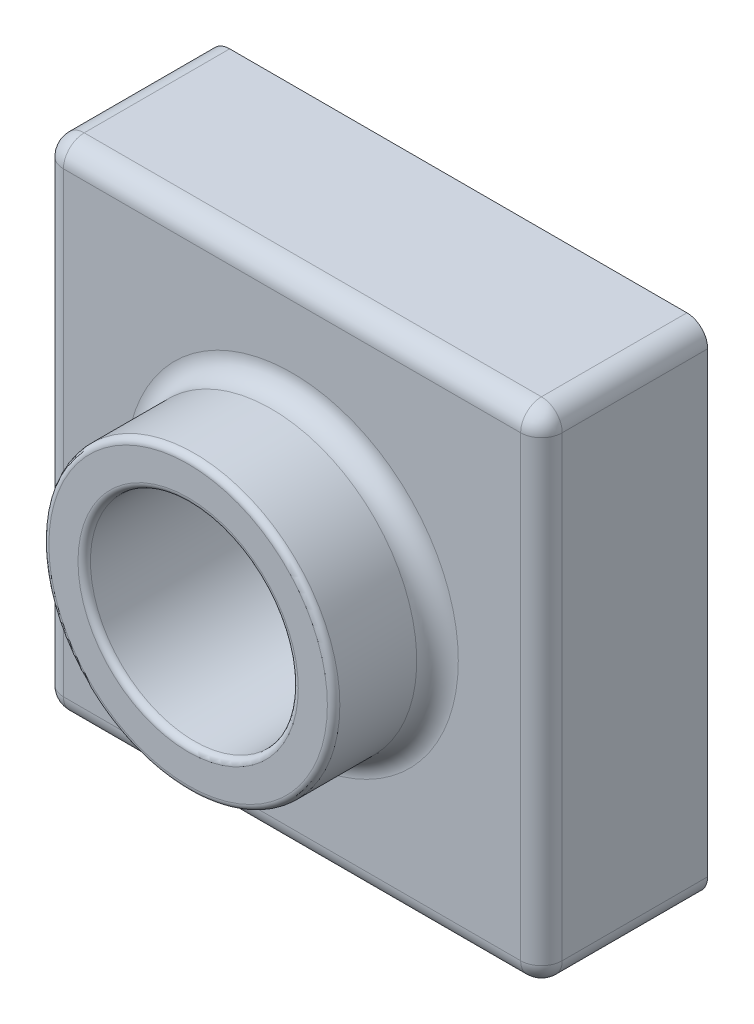
ISO-10303-21;
HEADER;
FILE_DESCRIPTION(('STEP AP214'),'2;1');
FILE_NAME('part.step','',(''),(''),'','','');
FILE_SCHEMA(('AUTOMOTIVE_DESIGN { 1 0 10303 214 1 1 1 1 }'));
ENDSEC;
DATA;
#1=APPLICATION_CONTEXT('core data for automotive mechanical design processes');
#2=APPLICATION_PROTOCOL_DEFINITION('international standard','automotive_design',2000,#1);
#3=PRODUCT_CONTEXT('',#1,'mechanical');
#4=PRODUCT('Part','Part','',(#3));
#5=PRODUCT_RELATED_PRODUCT_CATEGORY('part','',(#4));
#6=PRODUCT_DEFINITION_FORMATION('','',#4);
#7=PRODUCT_DEFINITION_CONTEXT('part definition',#1,'design');
#8=PRODUCT_DEFINITION('design','',#6,#7);
#9=PRODUCT_DEFINITION_SHAPE('','',#8);
#10=(LENGTH_UNIT() NAMED_UNIT(*) SI_UNIT(.MILLI.,.METRE.));
#11=(NAMED_UNIT(*) PLANE_ANGLE_UNIT() SI_UNIT($,.RADIAN.));
#12=(NAMED_UNIT(*) SI_UNIT($,.STERADIAN.) SOLID_ANGLE_UNIT());
#13=UNCERTAINTY_MEASURE_WITH_UNIT(LENGTH_MEASURE(1.E-05),#10,'distance_accuracy_value','');
#14=(GEOMETRIC_REPRESENTATION_CONTEXT(3) GLOBAL_UNCERTAINTY_ASSIGNED_CONTEXT((#13)) GLOBAL_UNIT_ASSIGNED_CONTEXT((#10,
#11,#12)) REPRESENTATION_CONTEXT('',''));
#15=CARTESIAN_POINT('',(0.,0.,0.));
#16=DIRECTION('',(0.,0.,1.));
#17=DIRECTION('',(1.,0.,0.));
#18=AXIS2_PLACEMENT_3D('',#15,#16,#17);
#19=CARTESIAN_POINT('',(0.,0.,0.));
#20=DIRECTION('',(0.,0.,-1.));
#21=DIRECTION('',(-1.,0.,0.));
#22=AXIS2_PLACEMENT_3D('',#19,#20,#21);
#23=PLANE('',#22);
#24=DIRECTION('',(0.,-1.,0.));
#25=VECTOR('',#24,1.);
#26=CARTESIAN_POINT('',(-60.,-60.,0.));
#27=LINE('',#26,#25);
#28=CARTESIAN_POINT('',(-60.,55.,0.));
#29=VERTEX_POINT('',#28);
#30=CARTESIAN_POINT('',(-60.,-55.,0.));
#31=VERTEX_POINT('',#30);
#32=EDGE_CURVE('E351',#29,#31,#27,.T.);
#33=ORIENTED_EDGE('',*,*,#32,.F.);
#34=CARTESIAN_POINT('',(-55.,55.,0.));
#35=DIRECTION('',(0.,0.,-1.));
#36=DIRECTION('',(-1.,0.,0.));
#37=AXIS2_PLACEMENT_3D('',#34,#35,#36);
#38=CIRCLE('',#37,5.);
#39=CARTESIAN_POINT('',(-55.,60.,0.));
#40=VERTEX_POINT('',#39);
#41=EDGE_CURVE('E425',#29,#40,#38,.T.);
#42=ORIENTED_EDGE('',*,*,#41,.T.);
#43=DIRECTION('',(-1.,0.,0.));
#44=VECTOR('',#43,1.);
#45=CARTESIAN_POINT('',(-60.,60.,0.));
#46=LINE('',#45,#44);
#47=CARTESIAN_POINT('',(55.,60.,0.));
#48=VERTEX_POINT('',#47);
#49=EDGE_CURVE('E347',#48,#40,#46,.T.);
#50=ORIENTED_EDGE('',*,*,#49,.F.);
#51=CARTESIAN_POINT('',(55.,55.,0.));
#52=DIRECTION('',(0.,0.,-1.));
#53=DIRECTION('',(-1.,0.,0.));
#54=AXIS2_PLACEMENT_3D('',#51,#52,#53);
#55=CIRCLE('',#54,5.);
#56=CARTESIAN_POINT('',(60.,55.,0.));
#57=VERTEX_POINT('',#56);
#58=EDGE_CURVE('E422',#48,#57,#55,.T.);
#59=ORIENTED_EDGE('',*,*,#58,.T.);
#60=DIRECTION('',(0.,1.,0.));
#61=VECTOR('',#60,1.);
#62=CARTESIAN_POINT('',(60.,-60.,0.));
#63=LINE('',#62,#61);
#64=CARTESIAN_POINT('',(60.,-55.,0.));
#65=VERTEX_POINT('',#64);
#66=EDGE_CURVE('E343',#65,#57,#63,.T.);
#67=ORIENTED_EDGE('',*,*,#66,.F.);
#68=CARTESIAN_POINT('',(55.,-55.,0.));
#69=DIRECTION('',(0.,0.,-1.));
#70=DIRECTION('',(-1.,0.,0.));
#71=AXIS2_PLACEMENT_3D('',#68,#69,#70);
#72=CIRCLE('',#71,5.);
#73=CARTESIAN_POINT('',(55.,-60.,0.));
#74=VERTEX_POINT('',#73);
#75=EDGE_CURVE('E419',#65,#74,#72,.T.);
#76=ORIENTED_EDGE('',*,*,#75,.T.);
#77=DIRECTION('',(1.,0.,0.));
#78=VECTOR('',#77,1.);
#79=CARTESIAN_POINT('',(-60.,-60.,0.));
#80=LINE('',#79,#78);
#81=CARTESIAN_POINT('',(-55.,-60.,0.));
#82=VERTEX_POINT('',#81);
#83=EDGE_CURVE('E355',#82,#74,#80,.T.);
#84=ORIENTED_EDGE('',*,*,#83,.F.);
#85=CARTESIAN_POINT('',(-55.,-55.,0.));
#86=DIRECTION('',(0.,0.,-1.));
#87=DIRECTION('',(-1.,0.,0.));
#88=AXIS2_PLACEMENT_3D('',#85,#86,#87);
#89=CIRCLE('',#88,5.);
#90=EDGE_CURVE('E416',#82,#31,#89,.T.);
#91=ORIENTED_EDGE('',*,*,#90,.T.);
#92=EDGE_LOOP('',(#33,#42,#50,#59,#67,#76,#84,#91));
#93=FACE_BOUND('',#92,.T.);
#94=CARTESIAN_POINT('',(-55.,55.,0.));
#95=DIRECTION('',(0.,0.,-1.));
#96=DIRECTION('',(-1.,0.,0.));
#97=AXIS2_PLACEMENT_3D('',#94,#95,#96);
#98=CIRCLE('',#97,3.);
#99=CARTESIAN_POINT('',(-58.,55.,0.));
#100=VERTEX_POINT('',#99);
#101=CARTESIAN_POINT('',(-55.,58.,0.));
#102=VERTEX_POINT('',#101);
#103=EDGE_CURVE('E309',#100,#102,#98,.T.);
#104=ORIENTED_EDGE('',*,*,#103,.F.);
#105=DIRECTION('',(0.,-1.,0.));
#106=VECTOR('',#105,1.);
#107=CARTESIAN_POINT('',(-58.,0.,0.));
#108=LINE('',#107,#106);
#109=CARTESIAN_POINT('',(-58.,-55.,0.));
#110=VERTEX_POINT('',#109);
#111=EDGE_CURVE('E323',#100,#110,#108,.T.);
#112=ORIENTED_EDGE('',*,*,#111,.T.);
#113=CARTESIAN_POINT('',(-55.,-55.,0.));
#114=DIRECTION('',(0.,0.,-1.));
#115=DIRECTION('',(-1.,0.,0.));
#116=AXIS2_PLACEMENT_3D('',#113,#114,#115);
#117=CIRCLE('',#116,3.);
#118=CARTESIAN_POINT('',(-55.,-58.,0.));
#119=VERTEX_POINT('',#118);
#120=EDGE_CURVE('E303',#119,#110,#117,.T.);
#121=ORIENTED_EDGE('',*,*,#120,.F.);
#122=DIRECTION('',(1.,0.,0.));
#123=VECTOR('',#122,1.);
#124=CARTESIAN_POINT('',(0.,-58.,0.));
#125=LINE('',#124,#123);
#126=CARTESIAN_POINT('',(55.,-58.,0.));
#127=VERTEX_POINT('',#126);
#128=EDGE_CURVE('E53',#119,#127,#125,.T.);
#129=ORIENTED_EDGE('',*,*,#128,.T.);
#130=CARTESIAN_POINT('',(55.,-55.,0.));
#131=DIRECTION('',(0.,0.,-1.));
#132=DIRECTION('',(-1.,0.,0.));
#133=AXIS2_PLACEMENT_3D('',#130,#131,#132);
#134=CIRCLE('',#133,3.);
#135=CARTESIAN_POINT('',(58.,-55.,0.));
#136=VERTEX_POINT('',#135);
#137=EDGE_CURVE('E318',#136,#127,#134,.T.);
#138=ORIENTED_EDGE('',*,*,#137,.F.);
#139=DIRECTION('',(0.,1.,0.));
#140=VECTOR('',#139,1.);
#141=CARTESIAN_POINT('',(58.,0.,0.));
#142=LINE('',#141,#140);
#143=CARTESIAN_POINT('',(58.,55.,0.));
#144=VERTEX_POINT('',#143);
#145=EDGE_CURVE('E314',#136,#144,#142,.T.);
#146=ORIENTED_EDGE('',*,*,#145,.T.);
#147=CARTESIAN_POINT('',(55.,55.,0.));
#148=DIRECTION('',(0.,0.,-1.));
#149=DIRECTION('',(-1.,0.,0.));
#150=AXIS2_PLACEMENT_3D('',#147,#148,#149);
#151=CIRCLE('',#150,3.);
#152=CARTESIAN_POINT('',(55.,58.,0.));
#153=VERTEX_POINT('',#152);
#154=EDGE_CURVE('E183',#153,#144,#151,.T.);
#155=ORIENTED_EDGE('',*,*,#154,.F.);
#156=DIRECTION('',(-1.,0.,0.));
#157=VECTOR('',#156,1.);
#158=CARTESIAN_POINT('',(0.,58.,0.));
#159=LINE('',#158,#157);
#160=EDGE_CURVE('E317',#153,#102,#159,.T.);
#161=ORIENTED_EDGE('',*,*,#160,.T.);
#162=EDGE_LOOP('',(#104,#112,#121,#129,#138,#146,#155,#161));
#163=FACE_BOUND('',#162,.T.);
#164=ADVANCED_FACE('F37',(#93,#163),#23,.T.);
#165=CARTESIAN_POINT('',(60.,-60.,40.));
#166=DIRECTION('',(-1.,0.,0.));
#167=DIRECTION('',(0.,0.,1.));
#168=AXIS2_PLACEMENT_3D('',#165,#166,#167);
#169=PLANE('',#168);
#170=ORIENTED_EDGE('',*,*,#66,.T.);
#171=DIRECTION('',(0.,0.,-1.));
#172=VECTOR('',#171,1.);
#173=CARTESIAN_POINT('',(60.,55.,40.));
#174=LINE('',#173,#172);
#175=CARTESIAN_POINT('',(60.,55.,35.));
#176=VERTEX_POINT('',#175);
#177=EDGE_CURVE('E61',#57,#176,#174,.F.);
#178=ORIENTED_EDGE('',*,*,#177,.T.);
#179=DIRECTION('',(0.,1.,0.));
#180=VECTOR('',#179,1.);
#181=CARTESIAN_POINT('',(60.,-60.,35.));
#182=LINE('',#181,#180);
#183=CARTESIAN_POINT('',(60.,-55.,35.));
#184=VERTEX_POINT('',#183);
#185=EDGE_CURVE('E407',#176,#184,#182,.F.);
#186=ORIENTED_EDGE('',*,*,#185,.T.);
#187=DIRECTION('',(0.,0.,-1.));
#188=VECTOR('',#187,1.);
#189=CARTESIAN_POINT('',(60.,-55.,40.));
#190=LINE('',#189,#188);
#191=EDGE_CURVE('E404',#184,#65,#190,.T.);
#192=ORIENTED_EDGE('',*,*,#191,.T.);
#193=EDGE_LOOP('',(#170,#178,#186,#192));
#194=FACE_BOUND('',#193,.T.);
#195=ADVANCED_FACE('F526',(#194),#169,.F.);
#196=CARTESIAN_POINT('',(-60.,60.,40.));
#197=DIRECTION('',(0.,-1.,0.));
#198=DIRECTION('',(0.,0.,-1.));
#199=AXIS2_PLACEMENT_3D('',#196,#197,#198);
#200=PLANE('',#199);
#201=ORIENTED_EDGE('',*,*,#49,.T.);
#202=DIRECTION('',(0.,0.,-1.));
#203=VECTOR('',#202,1.);
#204=CARTESIAN_POINT('',(-55.,60.,40.));
#205=LINE('',#204,#203);
#206=CARTESIAN_POINT('',(-55.,60.,35.));
#207=VERTEX_POINT('',#206);
#208=EDGE_CURVE('E401',#40,#207,#205,.F.);
#209=ORIENTED_EDGE('',*,*,#208,.T.);
#210=DIRECTION('',(-1.,0.,0.));
#211=VECTOR('',#210,1.);
#212=CARTESIAN_POINT('',(-60.,60.,35.));
#213=LINE('',#212,#211);
#214=CARTESIAN_POINT('',(55.,60.,35.));
#215=VERTEX_POINT('',#214);
#216=EDGE_CURVE('E398',#207,#215,#213,.F.);
#217=ORIENTED_EDGE('',*,*,#216,.T.);
#218=DIRECTION('',(0.,0.,-1.));
#219=VECTOR('',#218,1.);
#220=CARTESIAN_POINT('',(55.,60.,40.));
#221=LINE('',#220,#219);
#222=EDGE_CURVE('E395',#215,#48,#221,.T.);
#223=ORIENTED_EDGE('',*,*,#222,.T.);
#224=EDGE_LOOP('',(#201,#209,#217,#223));
#225=FACE_BOUND('',#224,.T.);
#226=ADVANCED_FACE('F531',(#225),#200,.F.);
#227=CARTESIAN_POINT('',(-60.,-60.,40.));
#228=DIRECTION('',(1.,0.,0.));
#229=DIRECTION('',(0.,0.,-1.));
#230=AXIS2_PLACEMENT_3D('',#227,#228,#229);
#231=PLANE('',#230);
#232=DIRECTION('',(0.,-1.,0.));
#233=VECTOR('',#232,1.);
#234=CARTESIAN_POINT('',(-60.,-60.,35.));
#235=LINE('',#234,#233);
#236=CARTESIAN_POINT('',(-60.,-55.,35.));
#237=VERTEX_POINT('',#236);
#238=CARTESIAN_POINT('',(-60.,55.,35.));
#239=VERTEX_POINT('',#238);
#240=EDGE_CURVE('E389',#237,#239,#235,.F.);
#241=ORIENTED_EDGE('',*,*,#240,.T.);
#242=DIRECTION('',(0.,0.,-1.));
#243=VECTOR('',#242,1.);
#244=CARTESIAN_POINT('',(-60.,55.,40.));
#245=LINE('',#244,#243);
#246=EDGE_CURVE('E392',#239,#29,#245,.T.);
#247=ORIENTED_EDGE('',*,*,#246,.T.);
#248=ORIENTED_EDGE('',*,*,#32,.T.);
#249=DIRECTION('',(0.,0.,-1.));
#250=VECTOR('',#249,1.);
#251=CARTESIAN_POINT('',(-60.,-55.,40.));
#252=LINE('',#251,#250);
#253=EDGE_CURVE('E386',#31,#237,#252,.F.);
#254=ORIENTED_EDGE('',*,*,#253,.T.);
#255=EDGE_LOOP('',(#241,#247,#248,#254));
#256=FACE_BOUND('',#255,.T.);
#257=ADVANCED_FACE('F907',(#256),#231,.F.);
#258=CARTESIAN_POINT('',(-60.,-60.,40.));
#259=DIRECTION('',(0.,1.,0.));
#260=DIRECTION('',(0.,0.,1.));
#261=AXIS2_PLACEMENT_3D('',#258,#259,#260);
#262=PLANE('',#261);
#263=ORIENTED_EDGE('',*,*,#83,.T.);
#264=DIRECTION('',(0.,0.,-1.));
#265=VECTOR('',#264,1.);
#266=CARTESIAN_POINT('',(55.,-60.,40.));
#267=LINE('',#266,#265);
#268=CARTESIAN_POINT('',(55.,-60.,35.));
#269=VERTEX_POINT('',#268);
#270=EDGE_CURVE('E383',#74,#269,#267,.F.);
#271=ORIENTED_EDGE('',*,*,#270,.T.);
#272=DIRECTION('',(1.,0.,0.));
#273=VECTOR('',#272,1.);
#274=CARTESIAN_POINT('',(-60.,-60.,35.));
#275=LINE('',#274,#273);
#276=CARTESIAN_POINT('',(-55.,-60.,35.));
#277=VERTEX_POINT('',#276);
#278=EDGE_CURVE('E379',#269,#277,#275,.F.);
#279=ORIENTED_EDGE('',*,*,#278,.T.);
#280=DIRECTION('',(0.,0.,-1.));
#281=VECTOR('',#280,1.);
#282=CARTESIAN_POINT('',(-55.,-60.,40.));
#283=LINE('',#282,#281);
#284=EDGE_CURVE('E376',#277,#82,#283,.T.);
#285=ORIENTED_EDGE('',*,*,#284,.T.);
#286=EDGE_LOOP('',(#263,#271,#279,#285));
#287=FACE_BOUND('',#286,.T.);
#288=ADVANCED_FACE('F520',(#287),#262,.F.);
#289=CARTESIAN_POINT('',(0.,0.,40.));
#290=DIRECTION('',(0.,0.,-1.));
#291=DIRECTION('',(-1.,0.,0.));
#292=AXIS2_PLACEMENT_3D('',#289,#290,#291);
#293=PLANE('',#292);
#294=DIRECTION('',(0.,-1.,0.));
#295=VECTOR('',#294,1.);
#296=CARTESIAN_POINT('',(-55.,0.,40.));
#297=LINE('',#296,#295);
#298=CARTESIAN_POINT('',(-55.,55.,40.));
#299=VERTEX_POINT('',#298);
#300=CARTESIAN_POINT('',(-55.,-55.,40.));
#301=VERTEX_POINT('',#300);
#302=EDGE_CURVE('E369',#299,#301,#297,.T.);
#303=ORIENTED_EDGE('',*,*,#302,.T.);
#304=DIRECTION('',(1.,0.,0.));
#305=VECTOR('',#304,1.);
#306=CARTESIAN_POINT('',(0.,-55.,40.));
#307=LINE('',#306,#305);
#308=CARTESIAN_POINT('',(55.,-55.,40.));
#309=VERTEX_POINT('',#308);
#310=EDGE_CURVE('E372',#301,#309,#307,.T.);
#311=ORIENTED_EDGE('',*,*,#310,.T.);
#312=DIRECTION('',(0.,1.,0.));
#313=VECTOR('',#312,1.);
#314=CARTESIAN_POINT('',(55.,0.,40.));
#315=LINE('',#314,#313);
#316=CARTESIAN_POINT('',(55.,55.,40.));
#317=VERTEX_POINT('',#316);
#318=EDGE_CURVE('E363',#309,#317,#315,.T.);
#319=ORIENTED_EDGE('',*,*,#318,.T.);
#320=DIRECTION('',(-1.,0.,0.));
#321=VECTOR('',#320,1.);
#322=CARTESIAN_POINT('',(0.,55.,40.));
#323=LINE('',#322,#321);
#324=EDGE_CURVE('E366',#317,#299,#323,.T.);
#325=ORIENTED_EDGE('',*,*,#324,.T.);
#326=EDGE_LOOP('',(#303,#311,#319,#325));
#327=FACE_BOUND('',#326,.T.);
#328=CARTESIAN_POINT('',(0.,0.,40.));
#329=DIRECTION('',(0.,0.,-1.));
#330=DIRECTION('',(-1.,0.,0.));
#331=AXIS2_PLACEMENT_3D('',#328,#329,#330);
#332=CIRCLE('',#331,40.);
#333=CARTESIAN_POINT('',(-40.,0.,40.));
#334=VERTEX_POINT('',#333);
#335=EDGE_CURVE('E359',#334,#334,#332,.T.);
#336=ORIENTED_EDGE('',*,*,#335,.T.);
#337=EDGE_LOOP('',(#336));
#338=FACE_BOUND('',#337,.T.);
#339=ADVANCED_FACE('F512',(#327,#338),#293,.F.);
#340=CARTESIAN_POINT('',(0.,0.,0.));
#341=DIRECTION('',(0.,0.,-1.));
#342=DIRECTION('',(-1.,0.,0.));
#343=AXIS2_PLACEMENT_3D('',#340,#341,#342);
#344=CIRCLE('',#343,27.);
#345=CARTESIAN_POINT('',(-27.,0.,0.));
#346=VERTEX_POINT('',#345);
#347=EDGE_CURVE('E239',#346,#346,#344,.F.);
#348=ORIENTED_EDGE('',*,*,#347,.F.);
#349=EDGE_LOOP('',(#348));
#350=FACE_BOUND('',#349,.T.);
#351=CARTESIAN_POINT('',(0.,0.,0.));
#352=DIRECTION('',(0.,0.,1.));
#353=DIRECTION('',(1.,0.,0.));
#354=AXIS2_PLACEMENT_3D('',#351,#352,#353);
#355=CIRCLE('',#354,25.);
#356=CARTESIAN_POINT('',(25.,0.,0.));
#357=VERTEX_POINT('',#356);
#358=EDGE_CURVE('E339',#357,#357,#355,.T.);
#359=ORIENTED_EDGE('',*,*,#358,.T.);
#360=EDGE_LOOP('',(#359));
#361=FACE_BOUND('',#360,.T.);
#362=ADVANCED_FACE('F510',(#350,#361),#23,.T.);
#363=CARTESIAN_POINT('',(0.,0.,65.));
#364=DIRECTION('',(0.,0.,-1.));
#365=DIRECTION('',(-1.,0.,0.));
#366=AXIS2_PLACEMENT_3D('',#363,#364,#365);
#367=CYLINDRICAL_SURFACE('',#366,35.);
#368=CARTESIAN_POINT('',(0.,0.,63.5));
#369=DIRECTION('',(0.,0.,1.));
#370=DIRECTION('',(1.,0.,0.));
#371=AXIS2_PLACEMENT_3D('',#368,#369,#370);
#372=CIRCLE('',#371,35.);
#373=CARTESIAN_POINT('',(35.,0.,63.5));
#374=VERTEX_POINT('',#373);
#375=EDGE_CURVE('E46',#374,#374,#372,.F.);
#376=ORIENTED_EDGE('',*,*,#375,.T.);
#377=EDGE_LOOP('',(#376));
#378=FACE_BOUND('',#377,.T.);
#379=CARTESIAN_POINT('',(0.,0.,45.));
#380=DIRECTION('',(0.,0.,-1.));
#381=DIRECTION('',(-1.,0.,0.));
#382=AXIS2_PLACEMENT_3D('',#379,#380,#381);
#383=CIRCLE('',#382,35.);
#384=CARTESIAN_POINT('',(-35.,0.,45.));
#385=VERTEX_POINT('',#384);
#386=EDGE_CURVE('E412',#385,#385,#383,.F.);
#387=ORIENTED_EDGE('',*,*,#386,.T.);
#388=EDGE_LOOP('',(#387));
#389=FACE_BOUND('',#388,.T.);
#390=ADVANCED_FACE('F484',(#378,#389),#367,.T.);
#391=CARTESIAN_POINT('',(0.,0.,65.));
#392=DIRECTION('',(0.,0.,1.));
#393=DIRECTION('',(1.,0.,0.));
#394=AXIS2_PLACEMENT_3D('',#391,#392,#393);
#395=PLANE('',#394);
#396=CARTESIAN_POINT('',(0.,0.,65.));
#397=DIRECTION('',(0.,0.,1.));
#398=DIRECTION('',(1.,0.,0.));
#399=AXIS2_PLACEMENT_3D('',#396,#397,#398);
#400=CIRCLE('',#399,33.5);
#401=CARTESIAN_POINT('',(33.5,0.,65.));
#402=VERTEX_POINT('',#401);
#403=EDGE_CURVE('E476',#402,#402,#400,.T.);
#404=ORIENTED_EDGE('',*,*,#403,.T.);
#405=EDGE_LOOP('',(#404));
#406=FACE_BOUND('',#405,.T.);
#407=CARTESIAN_POINT('',(0.,0.,65.));
#408=DIRECTION('',(0.,0.,1.));
#409=DIRECTION('',(1.,0.,0.));
#410=AXIS2_PLACEMENT_3D('',#407,#408,#409);
#411=CIRCLE('',#410,26.5);
#412=CARTESIAN_POINT('',(26.5,0.,65.));
#413=VERTEX_POINT('',#412);
#414=EDGE_CURVE('E428',#413,#413,#411,.F.);
#415=ORIENTED_EDGE('',*,*,#414,.T.);
#416=EDGE_LOOP('',(#415));
#417=FACE_BOUND('',#416,.T.);
#418=ADVANCED_FACE('F493',(#406,#417),#395,.T.);
#419=CARTESIAN_POINT('',(0.,0.,0.));
#420=DIRECTION('',(0.,0.,1.));
#421=DIRECTION('',(1.,0.,0.));
#422=AXIS2_PLACEMENT_3D('',#419,#420,#421);
#423=CYLINDRICAL_SURFACE('',#422,25.);
#424=CARTESIAN_POINT('',(0.,0.,63.5));
#425=DIRECTION('',(0.,0.,1.));
#426=DIRECTION('',(1.,0.,0.));
#427=AXIS2_PLACEMENT_3D('',#424,#425,#426);
#428=CIRCLE('',#427,25.);
#429=CARTESIAN_POINT('',(25.,0.,63.5));
#430=VERTEX_POINT('',#429);
#431=EDGE_CURVE('E11',#430,#430,#428,.T.);
#432=ORIENTED_EDGE('',*,*,#431,.T.);
#433=EDGE_LOOP('',(#432));
#434=FACE_BOUND('',#433,.T.);
#435=ORIENTED_EDGE('',*,*,#358,.F.);
#436=EDGE_LOOP('',(#435));
#437=FACE_BOUND('',#436,.T.);
#438=ADVANCED_FACE('F496',(#434,#437),#423,.F.);
#439=CARTESIAN_POINT('',(-55.,55.,40.));
#440=DIRECTION('',(0.,0.,-1.));
#441=DIRECTION('',(-1.,0.,0.));
#442=AXIS2_PLACEMENT_3D('',#439,#440,#441);
#443=CYLINDRICAL_SURFACE('',#442,5.);
#444=ORIENTED_EDGE('',*,*,#41,.F.);
#445=ORIENTED_EDGE('',*,*,#246,.F.);
#446=CARTESIAN_POINT('',(-55.,55.,35.));
#447=DIRECTION('',(0.,0.,1.));
#448=DIRECTION('',(1.,0.,0.));
#449=AXIS2_PLACEMENT_3D('',#446,#447,#448);
#450=CIRCLE('',#449,5.);
#451=EDGE_CURVE('E344',#207,#239,#450,.T.);
#452=ORIENTED_EDGE('',*,*,#451,.F.);
#453=ORIENTED_EDGE('',*,*,#208,.F.);
#454=EDGE_LOOP('',(#444,#445,#452,#453));
#455=FACE_BOUND('',#454,.T.);
#456=ADVANCED_FACE('F506',(#455),#443,.T.);
#457=CARTESIAN_POINT('',(0.,55.,35.));
#458=DIRECTION('',(-1.,0.,0.));
#459=DIRECTION('',(0.,0.,1.));
#460=AXIS2_PLACEMENT_3D('',#457,#458,#459);
#461=CYLINDRICAL_SURFACE('',#460,5.);
#462=CARTESIAN_POINT('',(55.,55.,35.));
#463=DIRECTION('',(1.,0.,0.));
#464=DIRECTION('',(0.,0.,-1.));
#465=AXIS2_PLACEMENT_3D('',#462,#463,#464);
#466=CIRCLE('',#465,5.);
#467=EDGE_CURVE('E462',#215,#317,#466,.T.);
#468=ORIENTED_EDGE('',*,*,#467,.F.);
#469=ORIENTED_EDGE('',*,*,#216,.F.);
#470=CARTESIAN_POINT('',(-55.,55.,35.));
#471=DIRECTION('',(-1.,0.,0.));
#472=DIRECTION('',(0.,0.,1.));
#473=AXIS2_PLACEMENT_3D('',#470,#471,#472);
#474=CIRCLE('',#473,5.);
#475=EDGE_CURVE('E466',#299,#207,#474,.T.);
#476=ORIENTED_EDGE('',*,*,#475,.F.);
#477=ORIENTED_EDGE('',*,*,#324,.F.);
#478=EDGE_LOOP('',(#468,#469,#476,#477));
#479=FACE_BOUND('',#478,.T.);
#480=ADVANCED_FACE('F858',(#479),#461,.T.);
#481=CARTESIAN_POINT('',(55.,55.,40.));
#482=DIRECTION('',(0.,0.,-1.));
#483=DIRECTION('',(-1.,0.,0.));
#484=AXIS2_PLACEMENT_3D('',#481,#482,#483);
#485=CYLINDRICAL_SURFACE('',#484,5.);
#486=ORIENTED_EDGE('',*,*,#58,.F.);
#487=ORIENTED_EDGE('',*,*,#222,.F.);
#488=CARTESIAN_POINT('',(55.,55.,35.));
#489=DIRECTION('',(0.,0.,1.));
#490=DIRECTION('',(1.,0.,0.));
#491=AXIS2_PLACEMENT_3D('',#488,#489,#490);
#492=CIRCLE('',#491,5.);
#493=EDGE_CURVE('E458',#176,#215,#492,.T.);
#494=ORIENTED_EDGE('',*,*,#493,.F.);
#495=ORIENTED_EDGE('',*,*,#177,.F.);
#496=EDGE_LOOP('',(#486,#487,#494,#495));
#497=FACE_BOUND('',#496,.T.);
#498=ADVANCED_FACE('F849',(#497),#485,.T.);
#499=CARTESIAN_POINT('',(-55.,55.,35.));
#500=DIRECTION('',(0.,1.,0.));
#501=DIRECTION('',(0.,0.,1.));
#502=AXIS2_PLACEMENT_3D('',#499,#500,#501);
#503=SPHERICAL_SURFACE('',#502,5.);
#504=ORIENTED_EDGE('',*,*,#475,.T.);
#505=ORIENTED_EDGE('',*,*,#451,.T.);
#506=CARTESIAN_POINT('',(-55.,55.,35.));
#507=DIRECTION('',(0.,1.,0.));
#508=DIRECTION('',(0.,0.,1.));
#509=AXIS2_PLACEMENT_3D('',#506,#507,#508);
#510=CIRCLE('',#509,5.);
#511=EDGE_CURVE('E454',#299,#239,#510,.F.);
#512=ORIENTED_EDGE('',*,*,#511,.F.);
#513=EDGE_LOOP('',(#504,#505,#512));
#514=FACE_BOUND('',#513,.T.);
#515=ADVANCED_FACE('F840',(#514),#503,.T.);
#516=CARTESIAN_POINT('',(55.,55.,35.));
#517=DIRECTION('',(0.,1.,0.));
#518=DIRECTION('',(-1.,0.,0.));
#519=AXIS2_PLACEMENT_3D('',#516,#517,#518);
#520=SPHERICAL_SURFACE('',#519,5.);
#521=ORIENTED_EDGE('',*,*,#493,.T.);
#522=ORIENTED_EDGE('',*,*,#467,.T.);
#523=CARTESIAN_POINT('',(55.,55.,35.));
#524=DIRECTION('',(0.,1.,0.));
#525=DIRECTION('',(0.,0.,1.));
#526=AXIS2_PLACEMENT_3D('',#523,#524,#525);
#527=CIRCLE('',#526,5.);
#528=EDGE_CURVE('E450',#176,#317,#527,.F.);
#529=ORIENTED_EDGE('',*,*,#528,.F.);
#530=EDGE_LOOP('',(#521,#522,#529));
#531=FACE_BOUND('',#530,.T.);
#532=ADVANCED_FACE('F831',(#531),#520,.T.);
#533=CARTESIAN_POINT('',(-55.,-55.,40.));
#534=DIRECTION('',(0.,0.,-1.));
#535=DIRECTION('',(-1.,0.,0.));
#536=AXIS2_PLACEMENT_3D('',#533,#534,#535);
#537=CYLINDRICAL_SURFACE('',#536,5.);
#538=ORIENTED_EDGE('',*,*,#90,.F.);
#539=ORIENTED_EDGE('',*,*,#284,.F.);
#540=CARTESIAN_POINT('',(-55.,-55.,35.));
#541=DIRECTION('',(0.,0.,1.));
#542=DIRECTION('',(1.,0.,0.));
#543=AXIS2_PLACEMENT_3D('',#540,#541,#542);
#544=CIRCLE('',#543,5.);
#545=EDGE_CURVE('E446',#237,#277,#544,.T.);
#546=ORIENTED_EDGE('',*,*,#545,.F.);
#547=ORIENTED_EDGE('',*,*,#253,.F.);
#548=EDGE_LOOP('',(#538,#539,#546,#547));
#549=FACE_BOUND('',#548,.T.);
#550=ADVANCED_FACE('F822',(#549),#537,.T.);
#551=CARTESIAN_POINT('',(-55.,0.,35.));
#552=DIRECTION('',(0.,-1.,0.));
#553=DIRECTION('',(0.,0.,-1.));
#554=AXIS2_PLACEMENT_3D('',#551,#552,#553);
#555=CYLINDRICAL_SURFACE('',#554,5.);
#556=ORIENTED_EDGE('',*,*,#511,.T.);
#557=ORIENTED_EDGE('',*,*,#240,.F.);
#558=CARTESIAN_POINT('',(-55.,-55.,35.));
#559=DIRECTION('',(0.,-1.,0.));
#560=DIRECTION('',(0.,0.,-1.));
#561=AXIS2_PLACEMENT_3D('',#558,#559,#560);
#562=CIRCLE('',#561,5.);
#563=EDGE_CURVE('E442',#301,#237,#562,.T.);
#564=ORIENTED_EDGE('',*,*,#563,.F.);
#565=ORIENTED_EDGE('',*,*,#302,.F.);
#566=EDGE_LOOP('',(#556,#557,#564,#565));
#567=FACE_BOUND('',#566,.T.);
#568=ADVANCED_FACE('F813',(#567),#555,.T.);
#569=CARTESIAN_POINT('',(55.,0.,35.));
#570=DIRECTION('',(0.,1.,0.));
#571=DIRECTION('',(0.,0.,1.));
#572=AXIS2_PLACEMENT_3D('',#569,#570,#571);
#573=CYLINDRICAL_SURFACE('',#572,5.);
#574=ORIENTED_EDGE('',*,*,#528,.T.);
#575=ORIENTED_EDGE('',*,*,#318,.F.);
#576=CARTESIAN_POINT('',(55.,-55.,35.));
#577=DIRECTION('',(0.,-1.,0.));
#578=DIRECTION('',(0.,0.,-1.));
#579=AXIS2_PLACEMENT_3D('',#576,#577,#578);
#580=CIRCLE('',#579,5.);
#581=EDGE_CURVE('E438',#184,#309,#580,.T.);
#582=ORIENTED_EDGE('',*,*,#581,.F.);
#583=ORIENTED_EDGE('',*,*,#185,.F.);
#584=EDGE_LOOP('',(#574,#575,#582,#583));
#585=FACE_BOUND('',#584,.T.);
#586=ADVANCED_FACE('F804',(#585),#573,.T.);
#587=CARTESIAN_POINT('',(55.,-55.,40.));
#588=DIRECTION('',(0.,0.,-1.));
#589=DIRECTION('',(-1.,0.,0.));
#590=AXIS2_PLACEMENT_3D('',#587,#588,#589);
#591=CYLINDRICAL_SURFACE('',#590,5.);
#592=ORIENTED_EDGE('',*,*,#75,.F.);
#593=ORIENTED_EDGE('',*,*,#191,.F.);
#594=CARTESIAN_POINT('',(55.,-55.,35.));
#595=DIRECTION('',(0.,0.,1.));
#596=DIRECTION('',(1.,0.,0.));
#597=AXIS2_PLACEMENT_3D('',#594,#595,#596);
#598=CIRCLE('',#597,5.);
#599=EDGE_CURVE('E434',#269,#184,#598,.T.);
#600=ORIENTED_EDGE('',*,*,#599,.F.);
#601=ORIENTED_EDGE('',*,*,#270,.F.);
#602=EDGE_LOOP('',(#592,#593,#600,#601));
#603=FACE_BOUND('',#602,.T.);
#604=ADVANCED_FACE('F795',(#603),#591,.T.);
#605=CARTESIAN_POINT('',(-55.,-55.,35.));
#606=DIRECTION('',(-1.,0.,0.));
#607=DIRECTION('',(0.,0.,1.));
#608=AXIS2_PLACEMENT_3D('',#605,#606,#607);
#609=SPHERICAL_SURFACE('',#608,5.);
#610=ORIENTED_EDGE('',*,*,#563,.T.);
#611=ORIENTED_EDGE('',*,*,#545,.T.);
#612=CARTESIAN_POINT('',(-55.,-55.,35.));
#613=DIRECTION('',(-1.,0.,0.));
#614=DIRECTION('',(0.,0.,1.));
#615=AXIS2_PLACEMENT_3D('',#612,#613,#614);
#616=CIRCLE('',#615,5.);
#617=EDGE_CURVE('E431',#301,#277,#616,.F.);
#618=ORIENTED_EDGE('',*,*,#617,.F.);
#619=EDGE_LOOP('',(#610,#611,#618));
#620=FACE_BOUND('',#619,.T.);
#621=ADVANCED_FACE('F786',(#620),#609,.T.);
#622=CARTESIAN_POINT('',(55.,-55.,35.));
#623=DIRECTION('',(1.,0.,0.));
#624=DIRECTION('',(0.,0.,-1.));
#625=AXIS2_PLACEMENT_3D('',#622,#623,#624);
#626=SPHERICAL_SURFACE('',#625,5.);
#627=ORIENTED_EDGE('',*,*,#599,.T.);
#628=ORIENTED_EDGE('',*,*,#581,.T.);
#629=CARTESIAN_POINT('',(55.,-55.,35.));
#630=DIRECTION('',(1.,0.,0.));
#631=DIRECTION('',(0.,0.,-1.));
#632=AXIS2_PLACEMENT_3D('',#629,#630,#631);
#633=CIRCLE('',#632,5.);
#634=EDGE_CURVE('E313',#269,#309,#633,.F.);
#635=ORIENTED_EDGE('',*,*,#634,.F.);
#636=EDGE_LOOP('',(#627,#628,#635));
#637=FACE_BOUND('',#636,.T.);
#638=ADVANCED_FACE('F777',(#637),#626,.T.);
#639=CARTESIAN_POINT('',(0.,-55.,35.));
#640=DIRECTION('',(1.,0.,0.));
#641=DIRECTION('',(0.,0.,-1.));
#642=AXIS2_PLACEMENT_3D('',#639,#640,#641);
#643=CYLINDRICAL_SURFACE('',#642,5.);
#644=ORIENTED_EDGE('',*,*,#617,.T.);
#645=ORIENTED_EDGE('',*,*,#278,.F.);
#646=ORIENTED_EDGE('',*,*,#634,.T.);
#647=ORIENTED_EDGE('',*,*,#310,.F.);
#648=EDGE_LOOP('',(#644,#645,#646,#647));
#649=FACE_BOUND('',#648,.T.);
#650=ADVANCED_FACE('F768',(#649),#643,.T.);
#651=CARTESIAN_POINT('',(0.,0.,45.));
#652=DIRECTION('',(0.,0.,-1.));
#653=DIRECTION('',(-1.,0.,0.));
#654=AXIS2_PLACEMENT_3D('',#651,#652,#653);
#655=TOROIDAL_SURFACE('',#654,40.,5.);
#656=ORIENTED_EDGE('',*,*,#335,.F.);
#657=EDGE_LOOP('',(#656));
#658=FACE_BOUND('',#657,.T.);
#659=ORIENTED_EDGE('',*,*,#386,.F.);
#660=EDGE_LOOP('',(#659));
#661=FACE_BOUND('',#660,.T.);
#662=ADVANCED_FACE('F490',(#658,#661),#655,.F.);
#663=CARTESIAN_POINT('',(0.,0.,63.5));
#664=DIRECTION('',(0.,0.,1.));
#665=DIRECTION('',(1.,0.,0.));
#666=AXIS2_PLACEMENT_3D('',#663,#664,#665);
#667=TOROIDAL_SURFACE('',#666,33.5,1.5);
#668=ORIENTED_EDGE('',*,*,#375,.F.);
#669=EDGE_LOOP('',(#668));
#670=FACE_BOUND('',#669,.T.);
#671=ORIENTED_EDGE('',*,*,#403,.F.);
#672=EDGE_LOOP('',(#671));
#673=FACE_BOUND('',#672,.T.);
#674=ADVANCED_FACE('F487',(#670,#673),#667,.T.);
#675=CARTESIAN_POINT('',(0.,0.,63.5));
#676=DIRECTION('',(0.,0.,1.));
#677=DIRECTION('',(1.,0.,0.));
#678=AXIS2_PLACEMENT_3D('',#675,#676,#677);
#679=TOROIDAL_SURFACE('',#678,26.5,1.5);
#680=ORIENTED_EDGE('',*,*,#414,.F.);
#681=EDGE_LOOP('',(#680));
#682=FACE_BOUND('',#681,.T.);
#683=ORIENTED_EDGE('',*,*,#431,.F.);
#684=EDGE_LOOP('',(#683));
#685=FACE_BOUND('',#684,.T.);
#686=ADVANCED_FACE('F39',(#682,#685),#679,.T.);
#687=CARTESIAN_POINT('',(58.,-60.,40.));
#688=DIRECTION('',(-1.,0.,0.));
#689=DIRECTION('',(0.,0.,1.));
#690=AXIS2_PLACEMENT_3D('',#687,#688,#689);
#691=PLANE('',#690);
#692=ORIENTED_EDGE('',*,*,#145,.F.);
#693=DIRECTION('',(0.,0.,1.));
#694=VECTOR('',#693,1.);
#695=CARTESIAN_POINT('',(58.,-55.,40.));
#696=LINE('',#695,#694);
#697=CARTESIAN_POINT('',(58.,-55.,35.));
#698=VERTEX_POINT('',#697);
#699=EDGE_CURVE('E214',#698,#136,#696,.F.);
#700=ORIENTED_EDGE('',*,*,#699,.F.);
#701=DIRECTION('',(0.,1.,0.));
#702=VECTOR('',#701,1.);
#703=CARTESIAN_POINT('',(58.,-60.,35.));
#704=LINE('',#703,#702);
#705=CARTESIAN_POINT('',(58.,55.,35.));
#706=VERTEX_POINT('',#705);
#707=EDGE_CURVE('E190',#706,#698,#704,.F.);
#708=ORIENTED_EDGE('',*,*,#707,.F.);
#709=DIRECTION('',(0.,0.,1.));
#710=VECTOR('',#709,1.);
#711=CARTESIAN_POINT('',(58.,55.,40.));
#712=LINE('',#711,#710);
#713=EDGE_CURVE('E178',#144,#706,#712,.T.);
#714=ORIENTED_EDGE('',*,*,#713,.F.);
#715=EDGE_LOOP('',(#692,#700,#708,#714));
#716=FACE_BOUND('',#715,.T.);
#717=ADVANCED_FACE('F213',(#716),#691,.T.);
#718=CARTESIAN_POINT('',(-60.,58.,40.));
#719=DIRECTION('',(0.,-1.,0.));
#720=DIRECTION('',(0.,0.,-1.));
#721=AXIS2_PLACEMENT_3D('',#718,#719,#720);
#722=PLANE('',#721);
#723=ORIENTED_EDGE('',*,*,#160,.F.);
#724=DIRECTION('',(0.,0.,-1.));
#725=VECTOR('',#724,1.);
#726=CARTESIAN_POINT('',(55.,58.,40.));
#727=LINE('',#726,#725);
#728=CARTESIAN_POINT('',(55.,58.,35.));
#729=VERTEX_POINT('',#728);
#730=EDGE_CURVE('E223',#729,#153,#727,.T.);
#731=ORIENTED_EDGE('',*,*,#730,.F.);
#732=DIRECTION('',(1.,0.,0.));
#733=VECTOR('',#732,1.);
#734=CARTESIAN_POINT('',(-60.,58.,35.));
#735=LINE('',#734,#733);
#736=CARTESIAN_POINT('',(-55.,58.,35.));
#737=VERTEX_POINT('',#736);
#738=EDGE_CURVE('E225',#737,#729,#735,.T.);
#739=ORIENTED_EDGE('',*,*,#738,.F.);
#740=DIRECTION('',(0.,0.,-1.));
#741=VECTOR('',#740,1.);
#742=CARTESIAN_POINT('',(-55.,58.,40.));
#743=LINE('',#742,#741);
#744=EDGE_CURVE('E220',#102,#737,#743,.F.);
#745=ORIENTED_EDGE('',*,*,#744,.F.);
#746=EDGE_LOOP('',(#723,#731,#739,#745));
#747=FACE_BOUND('',#746,.T.);
#748=ADVANCED_FACE('F546',(#747),#722,.T.);
#749=CARTESIAN_POINT('',(-58.,-60.,40.));
#750=DIRECTION('',(1.,0.,0.));
#751=DIRECTION('',(0.,0.,-1.));
#752=AXIS2_PLACEMENT_3D('',#749,#750,#751);
#753=PLANE('',#752);
#754=DIRECTION('',(0.,1.,0.));
#755=VECTOR('',#754,1.);
#756=CARTESIAN_POINT('',(-58.,-60.,35.));
#757=LINE('',#756,#755);
#758=CARTESIAN_POINT('',(-58.,-55.,35.));
#759=VERTEX_POINT('',#758);
#760=CARTESIAN_POINT('',(-58.,55.,35.));
#761=VERTEX_POINT('',#760);
#762=EDGE_CURVE('E234',#759,#761,#757,.T.);
#763=ORIENTED_EDGE('',*,*,#762,.F.);
#764=DIRECTION('',(0.,0.,-1.));
#765=VECTOR('',#764,1.);
#766=CARTESIAN_POINT('',(-58.,-55.,40.));
#767=LINE('',#766,#765);
#768=EDGE_CURVE('E243',#110,#759,#767,.F.);
#769=ORIENTED_EDGE('',*,*,#768,.F.);
#770=ORIENTED_EDGE('',*,*,#111,.F.);
#771=DIRECTION('',(0.,0.,-1.));
#772=VECTOR('',#771,1.);
#773=CARTESIAN_POINT('',(-58.,55.,40.));
#774=LINE('',#773,#772);
#775=EDGE_CURVE('E226',#761,#100,#774,.T.);
#776=ORIENTED_EDGE('',*,*,#775,.F.);
#777=EDGE_LOOP('',(#763,#769,#770,#776));
#778=FACE_BOUND('',#777,.T.);
#779=ADVANCED_FACE('F725',(#778),#753,.T.);
#780=CARTESIAN_POINT('',(-60.,-58.,40.));
#781=DIRECTION('',(0.,1.,0.));
#782=DIRECTION('',(0.,0.,1.));
#783=AXIS2_PLACEMENT_3D('',#780,#781,#782);
#784=PLANE('',#783);
#785=ORIENTED_EDGE('',*,*,#128,.F.);
#786=DIRECTION('',(0.,0.,1.));
#787=VECTOR('',#786,1.);
#788=CARTESIAN_POINT('',(-55.,-58.,40.));
#789=LINE('',#788,#787);
#790=CARTESIAN_POINT('',(-55.,-58.,35.));
#791=VERTEX_POINT('',#790);
#792=EDGE_CURVE('E261',#791,#119,#789,.F.);
#793=ORIENTED_EDGE('',*,*,#792,.F.);
#794=DIRECTION('',(1.,0.,0.));
#795=VECTOR('',#794,1.);
#796=CARTESIAN_POINT('',(-60.,-58.,35.));
#797=LINE('',#796,#795);
#798=CARTESIAN_POINT('',(55.,-58.,35.));
#799=VERTEX_POINT('',#798);
#800=EDGE_CURVE('E283',#799,#791,#797,.F.);
#801=ORIENTED_EDGE('',*,*,#800,.F.);
#802=DIRECTION('',(0.,0.,1.));
#803=VECTOR('',#802,1.);
#804=CARTESIAN_POINT('',(55.,-58.,40.));
#805=LINE('',#804,#803);
#806=EDGE_CURVE('E246',#127,#799,#805,.T.);
#807=ORIENTED_EDGE('',*,*,#806,.F.);
#808=EDGE_LOOP('',(#785,#793,#801,#807));
#809=FACE_BOUND('',#808,.T.);
#810=ADVANCED_FACE('F571',(#809),#784,.T.);
#811=CARTESIAN_POINT('',(0.,0.,38.));
#812=DIRECTION('',(0.,0.,-1.));
#813=DIRECTION('',(-1.,0.,0.));
#814=AXIS2_PLACEMENT_3D('',#811,#812,#813);
#815=PLANE('',#814);
#816=DIRECTION('',(0.,1.,0.));
#817=VECTOR('',#816,1.);
#818=CARTESIAN_POINT('',(-55.,0.,38.));
#819=LINE('',#818,#817);
#820=CARTESIAN_POINT('',(-55.,55.,38.));
#821=VERTEX_POINT('',#820);
#822=CARTESIAN_POINT('',(-55.,-55.,38.));
#823=VERTEX_POINT('',#822);
#824=EDGE_CURVE('E253',#821,#823,#819,.F.);
#825=ORIENTED_EDGE('',*,*,#824,.F.);
#826=DIRECTION('',(-1.,0.,0.));
#827=VECTOR('',#826,1.);
#828=CARTESIAN_POINT('',(0.,55.,38.));
#829=LINE('',#828,#827);
#830=CARTESIAN_POINT('',(55.,55.,38.));
#831=VERTEX_POINT('',#830);
#832=EDGE_CURVE('E257',#831,#821,#829,.T.);
#833=ORIENTED_EDGE('',*,*,#832,.F.);
#834=DIRECTION('',(0.,1.,0.));
#835=VECTOR('',#834,1.);
#836=CARTESIAN_POINT('',(55.,0.,38.));
#837=LINE('',#836,#835);
#838=CARTESIAN_POINT('',(55.,-55.,38.));
#839=VERTEX_POINT('',#838);
#840=EDGE_CURVE('E208',#839,#831,#837,.T.);
#841=ORIENTED_EDGE('',*,*,#840,.F.);
#842=DIRECTION('',(-1.,0.,0.));
#843=VECTOR('',#842,1.);
#844=CARTESIAN_POINT('',(0.,-55.,38.));
#845=LINE('',#844,#843);
#846=EDGE_CURVE('E256',#823,#839,#845,.F.);
#847=ORIENTED_EDGE('',*,*,#846,.F.);
#848=EDGE_LOOP('',(#825,#833,#841,#847));
#849=FACE_BOUND('',#848,.T.);
#850=CARTESIAN_POINT('',(0.,0.,38.));
#851=DIRECTION('',(0.,0.,-1.));
#852=DIRECTION('',(-1.,0.,0.));
#853=AXIS2_PLACEMENT_3D('',#850,#851,#852);
#854=CIRCLE('',#853,40.);
#855=CARTESIAN_POINT('',(-40.,0.,38.));
#856=VERTEX_POINT('',#855);
#857=EDGE_CURVE('E264',#856,#856,#854,.T.);
#858=ORIENTED_EDGE('',*,*,#857,.F.);
#859=EDGE_LOOP('',(#858));
#860=FACE_BOUND('',#859,.T.);
#861=ADVANCED_FACE('F557',(#849,#860),#815,.T.);
#862=CARTESIAN_POINT('',(0.,0.,65.));
#863=DIRECTION('',(0.,0.,-1.));
#864=DIRECTION('',(-1.,0.,0.));
#865=AXIS2_PLACEMENT_3D('',#862,#863,#864);
#866=CYLINDRICAL_SURFACE('',#865,33.);
#867=CARTESIAN_POINT('',(0.,0.,63.));
#868=DIRECTION('',(0.,0.,1.));
#869=DIRECTION('',(1.,0.,0.));
#870=AXIS2_PLACEMENT_3D('',#867,#868,#869);
#871=CIRCLE('',#870,33.);
#872=CARTESIAN_POINT('',(33.,0.,63.));
#873=VERTEX_POINT('',#872);
#874=EDGE_CURVE('E304',#873,#873,#871,.T.);
#875=ORIENTED_EDGE('',*,*,#874,.T.);
#876=EDGE_LOOP('',(#875));
#877=FACE_BOUND('',#876,.T.);
#878=CARTESIAN_POINT('',(0.,0.,45.));
#879=DIRECTION('',(0.,0.,-1.));
#880=DIRECTION('',(-1.,0.,0.));
#881=AXIS2_PLACEMENT_3D('',#878,#879,#880);
#882=CIRCLE('',#881,33.);
#883=CARTESIAN_POINT('',(-33.,0.,45.));
#884=VERTEX_POINT('',#883);
#885=EDGE_CURVE('E189',#884,#884,#882,.F.);
#886=ORIENTED_EDGE('',*,*,#885,.F.);
#887=EDGE_LOOP('',(#886));
#888=FACE_BOUND('',#887,.T.);
#889=ADVANCED_FACE('F600',(#877,#888),#866,.F.);
#890=CARTESIAN_POINT('',(0.,0.,63.));
#891=DIRECTION('',(0.,0.,1.));
#892=DIRECTION('',(1.,0.,0.));
#893=AXIS2_PLACEMENT_3D('',#890,#891,#892);
#894=PLANE('',#893);
#895=ORIENTED_EDGE('',*,*,#874,.F.);
#896=EDGE_LOOP('',(#895));
#897=FACE_BOUND('',#896,.T.);
#898=CARTESIAN_POINT('',(0.,0.,63.));
#899=DIRECTION('',(0.,0.,1.));
#900=DIRECTION('',(1.,0.,0.));
#901=AXIS2_PLACEMENT_3D('',#898,#899,#900);
#902=CIRCLE('',#901,27.);
#903=CARTESIAN_POINT('',(27.,0.,63.));
#904=VERTEX_POINT('',#903);
#905=EDGE_CURVE('E308',#904,#904,#902,.T.);
#906=ORIENTED_EDGE('',*,*,#905,.T.);
#907=EDGE_LOOP('',(#906));
#908=FACE_BOUND('',#907,.T.);
#909=ADVANCED_FACE('F602',(#897,#908),#894,.F.);
#910=CARTESIAN_POINT('',(0.,0.,0.));
#911=DIRECTION('',(0.,0.,1.));
#912=DIRECTION('',(1.,0.,0.));
#913=AXIS2_PLACEMENT_3D('',#910,#911,#912);
#914=CYLINDRICAL_SURFACE('',#913,27.);
#915=ORIENTED_EDGE('',*,*,#905,.F.);
#916=EDGE_LOOP('',(#915));
#917=FACE_BOUND('',#916,.T.);
#918=ORIENTED_EDGE('',*,*,#347,.T.);
#919=EDGE_LOOP('',(#918));
#920=FACE_BOUND('',#919,.T.);
#921=ADVANCED_FACE('F609',(#917,#920),#914,.T.);
#922=CARTESIAN_POINT('',(-55.,55.,40.));
#923=DIRECTION('',(0.,0.,-1.));
#924=DIRECTION('',(-1.,0.,0.));
#925=AXIS2_PLACEMENT_3D('',#922,#923,#924);
#926=CYLINDRICAL_SURFACE('',#925,3.);
#927=ORIENTED_EDGE('',*,*,#103,.T.);
#928=ORIENTED_EDGE('',*,*,#744,.T.);
#929=CARTESIAN_POINT('',(-55.,55.,35.));
#930=DIRECTION('',(0.,0.,-1.));
#931=DIRECTION('',(-1.,0.,0.));
#932=AXIS2_PLACEMENT_3D('',#929,#930,#931);
#933=CIRCLE('',#932,3.);
#934=EDGE_CURVE('E235',#737,#761,#933,.F.);
#935=ORIENTED_EDGE('',*,*,#934,.T.);
#936=ORIENTED_EDGE('',*,*,#775,.T.);
#937=EDGE_LOOP('',(#927,#928,#935,#936));
#938=FACE_BOUND('',#937,.T.);
#939=ADVANCED_FACE('F542',(#938),#926,.F.);
#940=CARTESIAN_POINT('',(0.,55.,35.));
#941=DIRECTION('',(-1.,0.,0.));
#942=DIRECTION('',(0.,0.,1.));
#943=AXIS2_PLACEMENT_3D('',#940,#941,#942);
#944=CYLINDRICAL_SURFACE('',#943,3.);
#945=CARTESIAN_POINT('',(55.,55.,35.));
#946=DIRECTION('',(-1.,0.,0.));
#947=DIRECTION('',(0.,0.,1.));
#948=AXIS2_PLACEMENT_3D('',#945,#946,#947);
#949=CIRCLE('',#948,3.);
#950=EDGE_CURVE('E199',#729,#831,#949,.F.);
#951=ORIENTED_EDGE('',*,*,#950,.T.);
#952=ORIENTED_EDGE('',*,*,#832,.T.);
#953=CARTESIAN_POINT('',(-55.,55.,35.));
#954=DIRECTION('',(-1.,0.,0.));
#955=DIRECTION('',(0.,0.,1.));
#956=AXIS2_PLACEMENT_3D('',#953,#954,#955);
#957=CIRCLE('',#956,3.);
#958=EDGE_CURVE('E240',#821,#737,#957,.T.);
#959=ORIENTED_EDGE('',*,*,#958,.T.);
#960=ORIENTED_EDGE('',*,*,#738,.T.);
#961=EDGE_LOOP('',(#951,#952,#959,#960));
#962=FACE_BOUND('',#961,.T.);
#963=ADVANCED_FACE('F554',(#962),#944,.F.);
#964=CARTESIAN_POINT('',(55.,55.,40.));
#965=DIRECTION('',(0.,0.,-1.));
#966=DIRECTION('',(-1.,0.,0.));
#967=AXIS2_PLACEMENT_3D('',#964,#965,#966);
#968=CYLINDRICAL_SURFACE('',#967,3.);
#969=ORIENTED_EDGE('',*,*,#154,.T.);
#970=ORIENTED_EDGE('',*,*,#713,.T.);
#971=CARTESIAN_POINT('',(55.,55.,35.));
#972=DIRECTION('',(0.,0.,1.));
#973=DIRECTION('',(1.,0.,0.));
#974=AXIS2_PLACEMENT_3D('',#971,#972,#973);
#975=CIRCLE('',#974,3.);
#976=EDGE_CURVE('E181',#706,#729,#975,.T.);
#977=ORIENTED_EDGE('',*,*,#976,.T.);
#978=ORIENTED_EDGE('',*,*,#730,.T.);
#979=EDGE_LOOP('',(#969,#970,#977,#978));
#980=FACE_BOUND('',#979,.T.);
#981=ADVANCED_FACE('F180',(#980),#968,.F.);
#982=CARTESIAN_POINT('',(-55.,55.,35.));
#983=DIRECTION('',(0.,1.,0.));
#984=DIRECTION('',(0.,0.,1.));
#985=AXIS2_PLACEMENT_3D('',#982,#983,#984);
#986=SPHERICAL_SURFACE('',#985,3.);
#987=ORIENTED_EDGE('',*,*,#958,.F.);
#988=CARTESIAN_POINT('',(-55.,55.,35.));
#989=DIRECTION('',(0.,-1.,0.));
#990=DIRECTION('',(0.,0.,-1.));
#991=AXIS2_PLACEMENT_3D('',#988,#989,#990);
#992=CIRCLE('',#991,3.);
#993=EDGE_CURVE('E201',#821,#761,#992,.T.);
#994=ORIENTED_EDGE('',*,*,#993,.T.);
#995=ORIENTED_EDGE('',*,*,#934,.F.);
#996=EDGE_LOOP('',(#987,#994,#995));
#997=FACE_BOUND('',#996,.T.);
#998=ADVANCED_FACE('F552',(#997),#986,.F.);
#999=CARTESIAN_POINT('',(55.,55.,35.));
#1000=DIRECTION('',(0.,1.,0.));
#1001=DIRECTION('',(-1.,0.,0.));
#1002=AXIS2_PLACEMENT_3D('',#999,#1000,#1001);
#1003=SPHERICAL_SURFACE('',#1002,3.);
#1004=ORIENTED_EDGE('',*,*,#976,.F.);
#1005=CARTESIAN_POINT('',(55.,55.,35.));
#1006=DIRECTION('',(0.,1.,0.));
#1007=DIRECTION('',(0.,0.,1.));
#1008=AXIS2_PLACEMENT_3D('',#1005,#1006,#1007);
#1009=CIRCLE('',#1008,3.);
#1010=EDGE_CURVE('E197',#706,#831,#1009,.F.);
#1011=ORIENTED_EDGE('',*,*,#1010,.T.);
#1012=ORIENTED_EDGE('',*,*,#950,.F.);
#1013=EDGE_LOOP('',(#1004,#1011,#1012));
#1014=FACE_BOUND('',#1013,.T.);
#1015=ADVANCED_FACE('F196',(#1014),#1003,.F.);
#1016=CARTESIAN_POINT('',(-55.,-55.,40.));
#1017=DIRECTION('',(0.,0.,-1.));
#1018=DIRECTION('',(-1.,0.,0.));
#1019=AXIS2_PLACEMENT_3D('',#1016,#1017,#1018);
#1020=CYLINDRICAL_SURFACE('',#1019,3.);
#1021=ORIENTED_EDGE('',*,*,#120,.T.);
#1022=ORIENTED_EDGE('',*,*,#768,.T.);
#1023=CARTESIAN_POINT('',(-55.,-55.,35.));
#1024=DIRECTION('',(0.,0.,-1.));
#1025=DIRECTION('',(0.,1.,0.));
#1026=AXIS2_PLACEMENT_3D('',#1023,#1024,#1025);
#1027=CIRCLE('',#1026,3.);
#1028=EDGE_CURVE('E211',#759,#791,#1027,.F.);
#1029=ORIENTED_EDGE('',*,*,#1028,.T.);
#1030=ORIENTED_EDGE('',*,*,#792,.T.);
#1031=EDGE_LOOP('',(#1021,#1022,#1029,#1030));
#1032=FACE_BOUND('',#1031,.T.);
#1033=ADVANCED_FACE('F573',(#1032),#1020,.F.);
#1034=CARTESIAN_POINT('',(-55.,0.,35.));
#1035=DIRECTION('',(0.,-1.,0.));
#1036=DIRECTION('',(0.,0.,-1.));
#1037=AXIS2_PLACEMENT_3D('',#1034,#1035,#1036);
#1038=CYLINDRICAL_SURFACE('',#1037,3.);
#1039=ORIENTED_EDGE('',*,*,#993,.F.);
#1040=ORIENTED_EDGE('',*,*,#824,.T.);
#1041=CARTESIAN_POINT('',(-55.,-55.,35.));
#1042=DIRECTION('',(0.,-1.,0.));
#1043=DIRECTION('',(0.,0.,-1.));
#1044=AXIS2_PLACEMENT_3D('',#1041,#1042,#1043);
#1045=CIRCLE('',#1044,3.);
#1046=EDGE_CURVE('E275',#823,#759,#1045,.T.);
#1047=ORIENTED_EDGE('',*,*,#1046,.T.);
#1048=ORIENTED_EDGE('',*,*,#762,.T.);
#1049=EDGE_LOOP('',(#1039,#1040,#1047,#1048));
#1050=FACE_BOUND('',#1049,.T.);
#1051=ADVANCED_FACE('F562',(#1050),#1038,.F.);
#1052=CARTESIAN_POINT('',(55.,0.,35.));
#1053=DIRECTION('',(0.,1.,0.));
#1054=DIRECTION('',(0.,0.,1.));
#1055=AXIS2_PLACEMENT_3D('',#1052,#1053,#1054);
#1056=CYLINDRICAL_SURFACE('',#1055,3.);
#1057=ORIENTED_EDGE('',*,*,#1010,.F.);
#1058=ORIENTED_EDGE('',*,*,#707,.T.);
#1059=CARTESIAN_POINT('',(55.,-55.,35.));
#1060=DIRECTION('',(0.,1.,0.));
#1061=DIRECTION('',(0.,0.,1.));
#1062=AXIS2_PLACEMENT_3D('',#1059,#1060,#1061);
#1063=CIRCLE('',#1062,3.);
#1064=EDGE_CURVE('E272',#698,#839,#1063,.F.);
#1065=ORIENTED_EDGE('',*,*,#1064,.T.);
#1066=ORIENTED_EDGE('',*,*,#840,.T.);
#1067=EDGE_LOOP('',(#1057,#1058,#1065,#1066));
#1068=FACE_BOUND('',#1067,.T.);
#1069=ADVANCED_FACE('F204',(#1068),#1056,.F.);
#1070=CARTESIAN_POINT('',(55.,-55.,40.));
#1071=DIRECTION('',(0.,0.,-1.));
#1072=DIRECTION('',(-1.,0.,0.));
#1073=AXIS2_PLACEMENT_3D('',#1070,#1071,#1072);
#1074=CYLINDRICAL_SURFACE('',#1073,3.);
#1075=ORIENTED_EDGE('',*,*,#137,.T.);
#1076=ORIENTED_EDGE('',*,*,#806,.T.);
#1077=CARTESIAN_POINT('',(55.,-55.,35.));
#1078=DIRECTION('',(0.,0.,1.));
#1079=DIRECTION('',(0.,-1.,0.));
#1080=AXIS2_PLACEMENT_3D('',#1077,#1078,#1079);
#1081=CIRCLE('',#1080,3.);
#1082=EDGE_CURVE('E276',#799,#698,#1081,.T.);
#1083=ORIENTED_EDGE('',*,*,#1082,.T.);
#1084=ORIENTED_EDGE('',*,*,#699,.T.);
#1085=EDGE_LOOP('',(#1075,#1076,#1083,#1084));
#1086=FACE_BOUND('',#1085,.T.);
#1087=ADVANCED_FACE('F577',(#1086),#1074,.F.);
#1088=CARTESIAN_POINT('',(-55.,-55.,35.));
#1089=DIRECTION('',(-1.,0.,0.));
#1090=DIRECTION('',(0.,0.,1.));
#1091=AXIS2_PLACEMENT_3D('',#1088,#1089,#1090);
#1092=SPHERICAL_SURFACE('',#1091,3.);
#1093=ORIENTED_EDGE('',*,*,#1046,.F.);
#1094=CARTESIAN_POINT('',(-55.,-55.,35.));
#1095=DIRECTION('',(1.,0.,0.));
#1096=DIRECTION('',(0.,0.,-1.));
#1097=AXIS2_PLACEMENT_3D('',#1094,#1095,#1096);
#1098=CIRCLE('',#1097,3.);
#1099=EDGE_CURVE('E280',#823,#791,#1098,.T.);
#1100=ORIENTED_EDGE('',*,*,#1099,.T.);
#1101=ORIENTED_EDGE('',*,*,#1028,.F.);
#1102=EDGE_LOOP('',(#1093,#1100,#1101));
#1103=FACE_BOUND('',#1102,.T.);
#1104=ADVANCED_FACE('F566',(#1103),#1092,.F.);
#1105=CARTESIAN_POINT('',(55.,-55.,35.));
#1106=DIRECTION('',(1.,0.,0.));
#1107=DIRECTION('',(0.,0.,-1.));
#1108=AXIS2_PLACEMENT_3D('',#1105,#1106,#1107);
#1109=SPHERICAL_SURFACE('',#1108,3.);
#1110=ORIENTED_EDGE('',*,*,#1082,.F.);
#1111=CARTESIAN_POINT('',(55.,-55.,35.));
#1112=DIRECTION('',(1.,0.,0.));
#1113=DIRECTION('',(0.,0.,-1.));
#1114=AXIS2_PLACEMENT_3D('',#1111,#1112,#1113);
#1115=CIRCLE('',#1114,3.);
#1116=EDGE_CURVE('E297',#799,#839,#1115,.F.);
#1117=ORIENTED_EDGE('',*,*,#1116,.T.);
#1118=ORIENTED_EDGE('',*,*,#1064,.F.);
#1119=EDGE_LOOP('',(#1110,#1117,#1118));
#1120=FACE_BOUND('',#1119,.T.);
#1121=ADVANCED_FACE('F580',(#1120),#1109,.F.);
#1122=CARTESIAN_POINT('',(0.,-55.,35.));
#1123=DIRECTION('',(1.,0.,0.));
#1124=DIRECTION('',(0.,0.,-1.));
#1125=AXIS2_PLACEMENT_3D('',#1122,#1123,#1124);
#1126=CYLINDRICAL_SURFACE('',#1125,3.);
#1127=ORIENTED_EDGE('',*,*,#1099,.F.);
#1128=ORIENTED_EDGE('',*,*,#846,.T.);
#1129=ORIENTED_EDGE('',*,*,#1116,.F.);
#1130=ORIENTED_EDGE('',*,*,#800,.T.);
#1131=EDGE_LOOP('',(#1127,#1128,#1129,#1130));
#1132=FACE_BOUND('',#1131,.T.);
#1133=ADVANCED_FACE('F568',(#1132),#1126,.F.);
#1134=CARTESIAN_POINT('',(0.,0.,45.));
#1135=DIRECTION('',(0.,0.,-1.));
#1136=DIRECTION('',(-1.,0.,0.));
#1137=AXIS2_PLACEMENT_3D('',#1134,#1135,#1136);
#1138=TOROIDAL_SURFACE('',#1137,40.,7.);
#1139=ORIENTED_EDGE('',*,*,#857,.T.);
#1140=EDGE_LOOP('',(#1139));
#1141=FACE_BOUND('',#1140,.T.);
#1142=ORIENTED_EDGE('',*,*,#885,.T.);
#1143=EDGE_LOOP('',(#1142));
#1144=FACE_BOUND('',#1143,.T.);
#1145=ADVANCED_FACE('F587',(#1141,#1144),#1138,.T.);
#1146=CLOSED_SHELL('',(#164,#195,#226,#257,#288,#339,#362,#390,#418,#438,#456,#480,#498,#515,
#532,#550,#568,#586,#604,#621,#638,#650,#662,#674,#686,#717,#748,#779,#810,#861,#889,#909,#921,
#939,#963,#981,#998,#1015,#1033,#1051,#1069,#1087,#1104,#1121,#1133,#1145));
#1147=MANIFOLD_SOLID_BREP('B2',#1146);
#1148=ADVANCED_BREP_SHAPE_REPRESENTATION('',(#18,#1147),#14);
#1149=SHAPE_DEFINITION_REPRESENTATION(#9,#1148);
ENDSEC;
END-ISO-10303-21;
